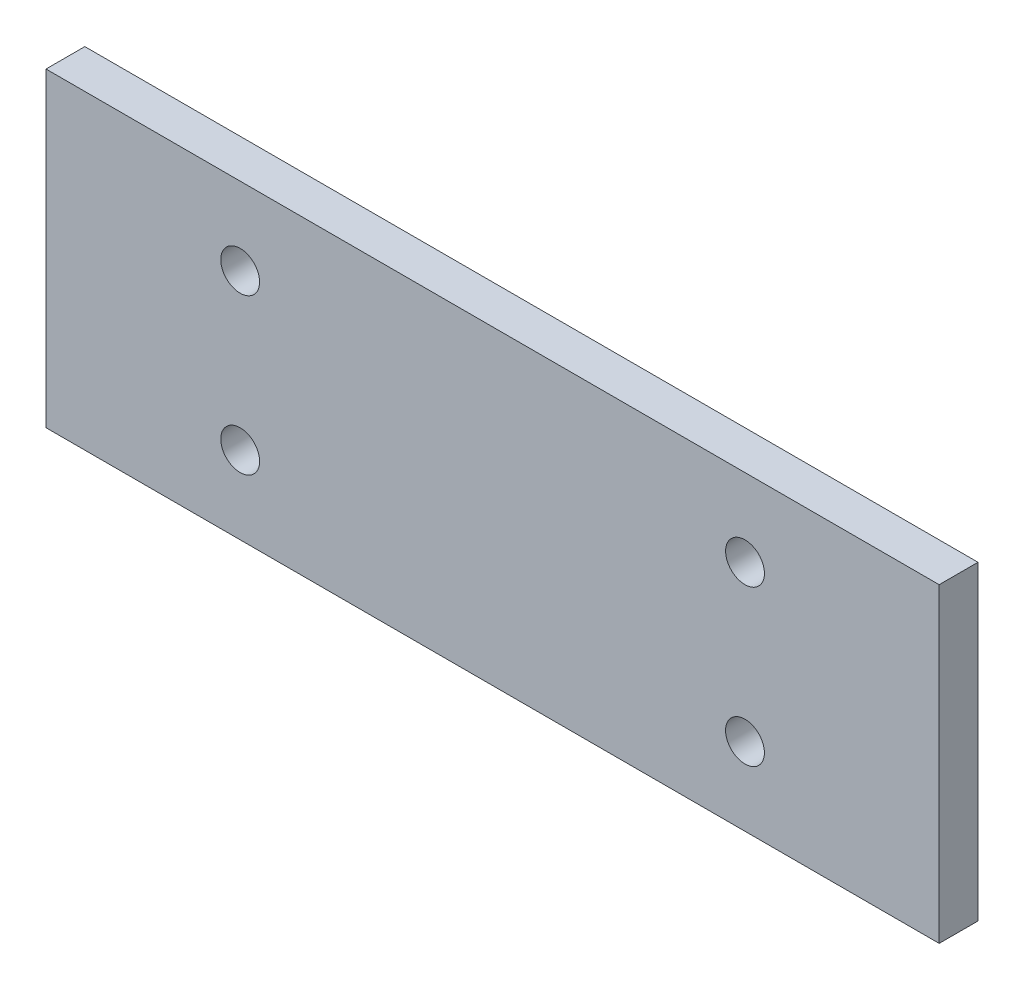
ISO-10303-21;
HEADER;
FILE_DESCRIPTION(('STEP AP214'),'2;1');
FILE_NAME('part.step','',(''),(''),'','','');
FILE_SCHEMA(('AUTOMOTIVE_DESIGN { 1 0 10303 214 1 1 1 1 }'));
ENDSEC;
DATA;
#1=APPLICATION_CONTEXT('core data for automotive mechanical design processes');
#2=APPLICATION_PROTOCOL_DEFINITION('international standard','automotive_design',2000,#1);
#3=PRODUCT_CONTEXT('',#1,'mechanical');
#4=PRODUCT('Part','Part','',(#3));
#5=PRODUCT_RELATED_PRODUCT_CATEGORY('part','',(#4));
#6=PRODUCT_DEFINITION_FORMATION('','',#4);
#7=PRODUCT_DEFINITION_CONTEXT('part definition',#1,'design');
#8=PRODUCT_DEFINITION('design','',#6,#7);
#9=PRODUCT_DEFINITION_SHAPE('','',#8);
#10=(LENGTH_UNIT() NAMED_UNIT(*) SI_UNIT(.MILLI.,.METRE.));
#11=(NAMED_UNIT(*) PLANE_ANGLE_UNIT() SI_UNIT($,.RADIAN.));
#12=(NAMED_UNIT(*) SI_UNIT($,.STERADIAN.) SOLID_ANGLE_UNIT());
#13=UNCERTAINTY_MEASURE_WITH_UNIT(LENGTH_MEASURE(1.E-05),#10,'distance_accuracy_value','');
#14=(GEOMETRIC_REPRESENTATION_CONTEXT(3) GLOBAL_UNCERTAINTY_ASSIGNED_CONTEXT((#13)) GLOBAL_UNIT_ASSIGNED_CONTEXT((#10,
#11,#12)) REPRESENTATION_CONTEXT('',''));
#15=CARTESIAN_POINT('',(0.,0.,0.));
#16=DIRECTION('',(0.,0.,1.));
#17=DIRECTION('',(1.,0.,0.));
#18=AXIS2_PLACEMENT_3D('',#15,#16,#17);
#19=CARTESIAN_POINT('',(57.5,20.,5.));
#20=DIRECTION('',(-1.,0.,0.));
#21=DIRECTION('',(0.,-1.,0.));
#22=AXIS2_PLACEMENT_3D('',#19,#20,#21);
#23=PLANE('',#22);
#24=DIRECTION('',(0.,1.,0.));
#25=VECTOR('',#24,1.);
#26=CARTESIAN_POINT('',(57.5,20.,0.));
#27=LINE('',#26,#25);
#28=CARTESIAN_POINT('',(57.5,-20.,0.));
#29=VERTEX_POINT('',#28);
#30=CARTESIAN_POINT('',(57.5,20.,0.));
#31=VERTEX_POINT('',#30);
#32=EDGE_CURVE('E100',#29,#31,#27,.T.);
#33=ORIENTED_EDGE('',*,*,#32,.T.);
#34=DIRECTION('',(0.,0.,-1.));
#35=VECTOR('',#34,1.);
#36=CARTESIAN_POINT('',(57.5,20.,5.));
#37=LINE('',#36,#35);
#38=CARTESIAN_POINT('',(57.5,20.,5.));
#39=VERTEX_POINT('',#38);
#40=EDGE_CURVE('E11',#39,#31,#37,.T.);
#41=ORIENTED_EDGE('',*,*,#40,.F.);
#42=DIRECTION('',(0.,1.,0.));
#43=VECTOR('',#42,1.);
#44=CARTESIAN_POINT('',(57.5,20.,5.));
#45=LINE('',#44,#43);
#46=CARTESIAN_POINT('',(57.5,-20.,5.));
#47=VERTEX_POINT('',#46);
#48=EDGE_CURVE('E88',#47,#39,#45,.T.);
#49=ORIENTED_EDGE('',*,*,#48,.F.);
#50=DIRECTION('',(0.,0.,-1.));
#51=VECTOR('',#50,1.);
#52=CARTESIAN_POINT('',(57.5,-20.,5.));
#53=LINE('',#52,#51);
#54=EDGE_CURVE('E96',#47,#29,#53,.T.);
#55=ORIENTED_EDGE('',*,*,#54,.T.);
#56=EDGE_LOOP('',(#33,#41,#49,#55));
#57=FACE_BOUND('',#56,.T.);
#58=ADVANCED_FACE('F37',(#57),#23,.F.);
#59=CARTESIAN_POINT('',(-57.5,20.,5.));
#60=DIRECTION('',(0.,-1.,0.));
#61=DIRECTION('',(0.,0.,-1.));
#62=AXIS2_PLACEMENT_3D('',#59,#60,#61);
#63=PLANE('',#62);
#64=DIRECTION('',(-1.,0.,0.));
#65=VECTOR('',#64,1.);
#66=CARTESIAN_POINT('',(-57.5,20.,0.));
#67=LINE('',#66,#65);
#68=CARTESIAN_POINT('',(-57.5,20.,0.));
#69=VERTEX_POINT('',#68);
#70=EDGE_CURVE('E92',#31,#69,#67,.T.);
#71=ORIENTED_EDGE('',*,*,#70,.T.);
#72=DIRECTION('',(0.,0.,-1.));
#73=VECTOR('',#72,1.);
#74=CARTESIAN_POINT('',(-57.5,20.,5.));
#75=LINE('',#74,#73);
#76=CARTESIAN_POINT('',(-57.5,20.,5.));
#77=VERTEX_POINT('',#76);
#78=EDGE_CURVE('E45',#77,#69,#75,.T.);
#79=ORIENTED_EDGE('',*,*,#78,.F.);
#80=DIRECTION('',(-1.,0.,0.));
#81=VECTOR('',#80,1.);
#82=CARTESIAN_POINT('',(-57.5,20.,5.));
#83=LINE('',#82,#81);
#84=EDGE_CURVE('E83',#39,#77,#83,.T.);
#85=ORIENTED_EDGE('',*,*,#84,.F.);
#86=ORIENTED_EDGE('',*,*,#40,.T.);
#87=EDGE_LOOP('',(#71,#79,#85,#86));
#88=FACE_BOUND('',#87,.T.);
#89=ADVANCED_FACE('F91',(#88),#63,.F.);
#90=CARTESIAN_POINT('',(-57.5,20.,5.));
#91=DIRECTION('',(1.,0.,0.));
#92=DIRECTION('',(0.,1.,0.));
#93=AXIS2_PLACEMENT_3D('',#90,#91,#92);
#94=PLANE('',#93);
#95=DIRECTION('',(0.,-1.,0.));
#96=VECTOR('',#95,1.);
#97=CARTESIAN_POINT('',(-57.5,20.,0.));
#98=LINE('',#97,#96);
#99=CARTESIAN_POINT('',(-57.5,-20.,0.));
#100=VERTEX_POINT('',#99);
#101=EDGE_CURVE('E70',#69,#100,#98,.T.);
#102=ORIENTED_EDGE('',*,*,#101,.T.);
#103=DIRECTION('',(0.,0.,-1.));
#104=VECTOR('',#103,1.);
#105=CARTESIAN_POINT('',(-57.5,-20.,5.));
#106=LINE('',#105,#104);
#107=CARTESIAN_POINT('',(-57.5,-20.,5.));
#108=VERTEX_POINT('',#107);
#109=EDGE_CURVE('E93',#108,#100,#106,.T.);
#110=ORIENTED_EDGE('',*,*,#109,.F.);
#111=DIRECTION('',(0.,-1.,0.));
#112=VECTOR('',#111,1.);
#113=CARTESIAN_POINT('',(-57.5,20.,5.));
#114=LINE('',#113,#112);
#115=EDGE_CURVE('E86',#77,#108,#114,.T.);
#116=ORIENTED_EDGE('',*,*,#115,.F.);
#117=ORIENTED_EDGE('',*,*,#78,.T.);
#118=EDGE_LOOP('',(#102,#110,#116,#117));
#119=FACE_BOUND('',#118,.T.);
#120=ADVANCED_FACE('F94',(#119),#94,.F.);
#121=CARTESIAN_POINT('',(-57.5,-20.,5.));
#122=DIRECTION('',(0.,1.,0.));
#123=DIRECTION('',(0.,0.,1.));
#124=AXIS2_PLACEMENT_3D('',#121,#122,#123);
#125=PLANE('',#124);
#126=DIRECTION('',(1.,0.,0.));
#127=VECTOR('',#126,1.);
#128=CARTESIAN_POINT('',(-57.5,-20.,0.));
#129=LINE('',#128,#127);
#130=EDGE_CURVE('E76',#100,#29,#129,.T.);
#131=ORIENTED_EDGE('',*,*,#130,.T.);
#132=ORIENTED_EDGE('',*,*,#54,.F.);
#133=DIRECTION('',(1.,0.,0.));
#134=VECTOR('',#133,1.);
#135=CARTESIAN_POINT('',(-57.5,-20.,5.));
#136=LINE('',#135,#134);
#137=EDGE_CURVE('E53',#108,#47,#136,.T.);
#138=ORIENTED_EDGE('',*,*,#137,.F.);
#139=ORIENTED_EDGE('',*,*,#109,.T.);
#140=EDGE_LOOP('',(#131,#132,#138,#139));
#141=FACE_BOUND('',#140,.T.);
#142=ADVANCED_FACE('F108',(#141),#125,.F.);
#143=CARTESIAN_POINT('',(0.,0.,5.));
#144=DIRECTION('',(0.,0.,1.));
#145=DIRECTION('',(1.,0.,0.));
#146=AXIS2_PLACEMENT_3D('',#143,#144,#145);
#147=PLANE('',#146);
#148=CARTESIAN_POINT('',(32.5,10.,5.));
#149=DIRECTION('',(0.,0.,-1.));
#150=DIRECTION('',(1.,0.,0.));
#151=AXIS2_PLACEMENT_3D('',#148,#149,#150);
#152=CIRCLE('',#151,2.5);
#153=CARTESIAN_POINT('',(35.,10.,5.));
#154=VERTEX_POINT('',#153);
#155=EDGE_CURVE('E120',#154,#154,#152,.T.);
#156=ORIENTED_EDGE('',*,*,#155,.T.);
#157=EDGE_LOOP('',(#156));
#158=FACE_BOUND('',#157,.T.);
#159=CARTESIAN_POINT('',(-32.5,10.,5.));
#160=DIRECTION('',(0.,0.,-1.));
#161=DIRECTION('',(1.,0.,0.));
#162=AXIS2_PLACEMENT_3D('',#159,#160,#161);
#163=CIRCLE('',#162,2.5);
#164=CARTESIAN_POINT('',(-30.,10.,5.));
#165=VERTEX_POINT('',#164);
#166=EDGE_CURVE('E126',#165,#165,#163,.T.);
#167=ORIENTED_EDGE('',*,*,#166,.T.);
#168=EDGE_LOOP('',(#167));
#169=FACE_BOUND('',#168,.T.);
#170=CARTESIAN_POINT('',(-32.5,-9.99999999999999,5.));
#171=DIRECTION('',(0.,0.,-1.));
#172=DIRECTION('',(-1.,0.,0.));
#173=AXIS2_PLACEMENT_3D('',#170,#171,#172);
#174=CIRCLE('',#173,2.5);
#175=CARTESIAN_POINT('',(-35.,-9.99999999999999,5.));
#176=VERTEX_POINT('',#175);
#177=EDGE_CURVE('E132',#176,#176,#174,.T.);
#178=ORIENTED_EDGE('',*,*,#177,.T.);
#179=EDGE_LOOP('',(#178));
#180=FACE_BOUND('',#179,.T.);
#181=CARTESIAN_POINT('',(32.5,-9.99999999999999,5.));
#182=DIRECTION('',(0.,0.,-1.));
#183=DIRECTION('',(-1.,0.,0.));
#184=AXIS2_PLACEMENT_3D('',#181,#182,#183);
#185=CIRCLE('',#184,2.5);
#186=CARTESIAN_POINT('',(30.,-9.99999999999999,5.));
#187=VERTEX_POINT('',#186);
#188=EDGE_CURVE('E103',#187,#187,#185,.T.);
#189=ORIENTED_EDGE('',*,*,#188,.T.);
#190=EDGE_LOOP('',(#189));
#191=FACE_BOUND('',#190,.T.);
#192=ORIENTED_EDGE('',*,*,#48,.T.);
#193=ORIENTED_EDGE('',*,*,#84,.T.);
#194=ORIENTED_EDGE('',*,*,#115,.T.);
#195=ORIENTED_EDGE('',*,*,#137,.T.);
#196=EDGE_LOOP('',(#192,#193,#194,#195));
#197=FACE_BOUND('',#196,.T.);
#198=ADVANCED_FACE('F84',(#158,#169,#180,#191,#197),#147,.T.);
#199=CARTESIAN_POINT('',(0.,0.,0.));
#200=DIRECTION('',(0.,0.,1.));
#201=DIRECTION('',(1.,0.,0.));
#202=AXIS2_PLACEMENT_3D('',#199,#200,#201);
#203=PLANE('',#202);
#204=CARTESIAN_POINT('',(32.5,10.,0.));
#205=DIRECTION('',(0.,0.,-1.));
#206=DIRECTION('',(1.,0.,0.));
#207=AXIS2_PLACEMENT_3D('',#204,#205,#206);
#208=CIRCLE('',#207,2.5);
#209=CARTESIAN_POINT('',(35.,10.,0.));
#210=VERTEX_POINT('',#209);
#211=EDGE_CURVE('E123',#210,#210,#208,.T.);
#212=ORIENTED_EDGE('',*,*,#211,.F.);
#213=EDGE_LOOP('',(#212));
#214=FACE_BOUND('',#213,.T.);
#215=CARTESIAN_POINT('',(-32.5,10.,0.));
#216=DIRECTION('',(0.,0.,-1.));
#217=DIRECTION('',(1.,0.,0.));
#218=AXIS2_PLACEMENT_3D('',#215,#216,#217);
#219=CIRCLE('',#218,2.5);
#220=CARTESIAN_POINT('',(-30.,10.,0.));
#221=VERTEX_POINT('',#220);
#222=EDGE_CURVE('E129',#221,#221,#219,.T.);
#223=ORIENTED_EDGE('',*,*,#222,.F.);
#224=EDGE_LOOP('',(#223));
#225=FACE_BOUND('',#224,.T.);
#226=CARTESIAN_POINT('',(-32.5,-9.99999999999999,0.));
#227=DIRECTION('',(0.,0.,-1.));
#228=DIRECTION('',(-1.,0.,0.));
#229=AXIS2_PLACEMENT_3D('',#226,#227,#228);
#230=CIRCLE('',#229,2.5);
#231=CARTESIAN_POINT('',(-35.,-9.99999999999999,0.));
#232=VERTEX_POINT('',#231);
#233=EDGE_CURVE('E117',#232,#232,#230,.T.);
#234=ORIENTED_EDGE('',*,*,#233,.F.);
#235=EDGE_LOOP('',(#234));
#236=FACE_BOUND('',#235,.T.);
#237=CARTESIAN_POINT('',(32.5,-9.99999999999999,0.));
#238=DIRECTION('',(0.,0.,-1.));
#239=DIRECTION('',(-1.,0.,0.));
#240=AXIS2_PLACEMENT_3D('',#237,#238,#239);
#241=CIRCLE('',#240,2.5);
#242=CARTESIAN_POINT('',(30.,-9.99999999999999,0.));
#243=VERTEX_POINT('',#242);
#244=EDGE_CURVE('E114',#243,#243,#241,.T.);
#245=ORIENTED_EDGE('',*,*,#244,.F.);
#246=EDGE_LOOP('',(#245));
#247=FACE_BOUND('',#246,.T.);
#248=ORIENTED_EDGE('',*,*,#32,.F.);
#249=ORIENTED_EDGE('',*,*,#130,.F.);
#250=ORIENTED_EDGE('',*,*,#101,.F.);
#251=ORIENTED_EDGE('',*,*,#70,.F.);
#252=EDGE_LOOP('',(#248,#249,#250,#251));
#253=FACE_BOUND('',#252,.T.);
#254=ADVANCED_FACE('F111',(#214,#225,#236,#247,#253),#203,.F.);
#255=CARTESIAN_POINT('',(32.5,-9.99999999999999,5.));
#256=DIRECTION('',(0.,0.,-1.));
#257=DIRECTION('',(-1.,0.,0.));
#258=AXIS2_PLACEMENT_3D('',#255,#256,#257);
#259=CYLINDRICAL_SURFACE('',#258,2.5);
#260=ORIENTED_EDGE('',*,*,#188,.F.);
#261=EDGE_LOOP('',(#260));
#262=FACE_BOUND('',#261,.T.);
#263=ORIENTED_EDGE('',*,*,#244,.T.);
#264=EDGE_LOOP('',(#263));
#265=FACE_BOUND('',#264,.T.);
#266=ADVANCED_FACE('F142',(#262,#265),#259,.F.);
#267=CARTESIAN_POINT('',(-32.5,-9.99999999999999,5.));
#268=DIRECTION('',(0.,0.,-1.));
#269=DIRECTION('',(-1.,0.,0.));
#270=AXIS2_PLACEMENT_3D('',#267,#268,#269);
#271=CYLINDRICAL_SURFACE('',#270,2.5);
#272=ORIENTED_EDGE('',*,*,#177,.F.);
#273=EDGE_LOOP('',(#272));
#274=FACE_BOUND('',#273,.T.);
#275=ORIENTED_EDGE('',*,*,#233,.T.);
#276=EDGE_LOOP('',(#275));
#277=FACE_BOUND('',#276,.T.);
#278=ADVANCED_FACE('F138',(#274,#277),#271,.F.);
#279=CARTESIAN_POINT('',(-32.5,10.,5.));
#280=DIRECTION('',(0.,0.,-1.));
#281=DIRECTION('',(-1.,0.,0.));
#282=AXIS2_PLACEMENT_3D('',#279,#280,#281);
#283=CYLINDRICAL_SURFACE('',#282,2.5);
#284=ORIENTED_EDGE('',*,*,#166,.F.);
#285=EDGE_LOOP('',(#284));
#286=FACE_BOUND('',#285,.T.);
#287=ORIENTED_EDGE('',*,*,#222,.T.);
#288=EDGE_LOOP('',(#287));
#289=FACE_BOUND('',#288,.T.);
#290=ADVANCED_FACE('F153',(#286,#289),#283,.F.);
#291=CARTESIAN_POINT('',(32.5,10.,5.));
#292=DIRECTION('',(0.,0.,-1.));
#293=DIRECTION('',(-1.,0.,0.));
#294=AXIS2_PLACEMENT_3D('',#291,#292,#293);
#295=CYLINDRICAL_SURFACE('',#294,2.5);
#296=ORIENTED_EDGE('',*,*,#155,.F.);
#297=EDGE_LOOP('',(#296));
#298=FACE_BOUND('',#297,.T.);
#299=ORIENTED_EDGE('',*,*,#211,.T.);
#300=EDGE_LOOP('',(#299));
#301=FACE_BOUND('',#300,.T.);
#302=ADVANCED_FACE('F182',(#298,#301),#295,.F.);
#303=CLOSED_SHELL('',(#58,#89,#120,#142,#198,#254,#266,#278,#290,#302));
#304=MANIFOLD_SOLID_BREP('B2',#303);
#305=ADVANCED_BREP_SHAPE_REPRESENTATION('',(#18,#304),#14);
#306=SHAPE_DEFINITION_REPRESENTATION(#9,#305);
ENDSEC;
END-ISO-10303-21;
